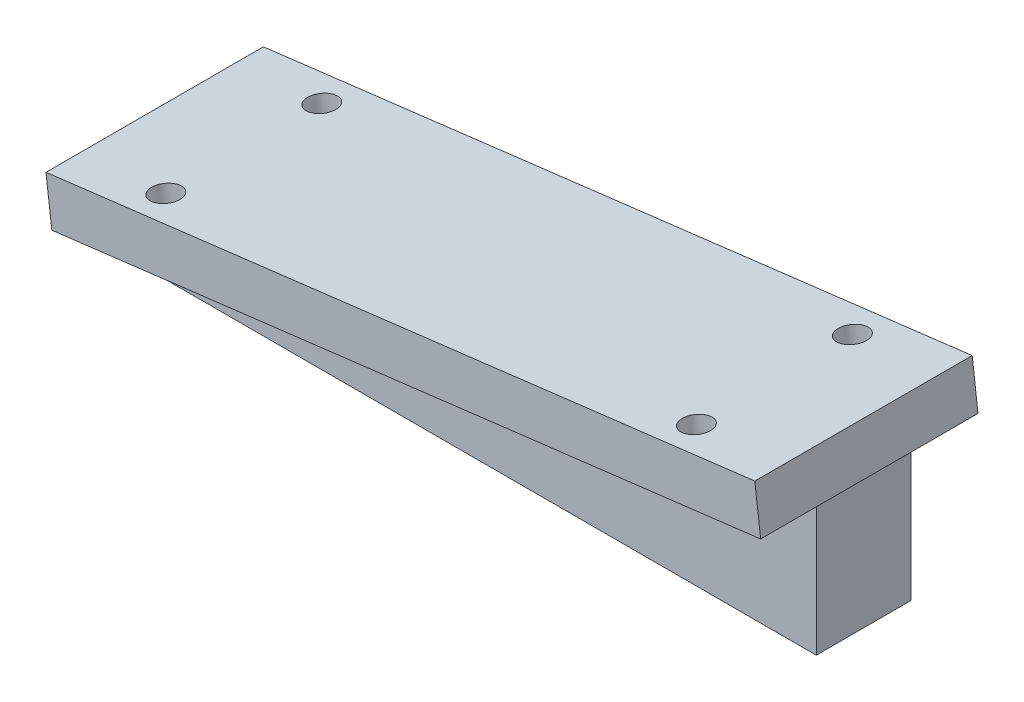
ISO-10303-21;
HEADER;
FILE_DESCRIPTION(('STEP AP214'),'2;1');
FILE_NAME('part.step','',(''),(''),'','','');
FILE_SCHEMA(('AUTOMOTIVE_DESIGN { 1 0 10303 214 1 1 1 1 }'));
ENDSEC;
DATA;
#1=APPLICATION_CONTEXT('core data for automotive mechanical design processes');
#2=APPLICATION_PROTOCOL_DEFINITION('international standard','automotive_design',2000,#1);
#3=PRODUCT_CONTEXT('',#1,'mechanical');
#4=PRODUCT('Part','Part','',(#3));
#5=PRODUCT_RELATED_PRODUCT_CATEGORY('part','',(#4));
#6=PRODUCT_DEFINITION_FORMATION('','',#4);
#7=PRODUCT_DEFINITION_CONTEXT('part definition',#1,'design');
#8=PRODUCT_DEFINITION('design','',#6,#7);
#9=PRODUCT_DEFINITION_SHAPE('','',#8);
#10=(LENGTH_UNIT() NAMED_UNIT(*) SI_UNIT(.MILLI.,.METRE.));
#11=(NAMED_UNIT(*) PLANE_ANGLE_UNIT() SI_UNIT($,.RADIAN.));
#12=(NAMED_UNIT(*) SI_UNIT($,.STERADIAN.) SOLID_ANGLE_UNIT());
#13=UNCERTAINTY_MEASURE_WITH_UNIT(LENGTH_MEASURE(1.E-05),#10,'distance_accuracy_value','');
#14=(GEOMETRIC_REPRESENTATION_CONTEXT(3) GLOBAL_UNCERTAINTY_ASSIGNED_CONTEXT((#13)) GLOBAL_UNIT_ASSIGNED_CONTEXT((#10,
#11,#12)) REPRESENTATION_CONTEXT('',''));
#15=CARTESIAN_POINT('',(0.,0.,0.));
#16=DIRECTION('',(0.,0.,1.));
#17=DIRECTION('',(1.,0.,0.));
#18=AXIS2_PLACEMENT_3D('',#15,#16,#17);
#19=CARTESIAN_POINT('',(75.0000000000001,10.,10.));
#20=DIRECTION('',(-1.,0.,0.));
#21=DIRECTION('',(0.,0.,1.));
#22=AXIS2_PLACEMENT_3D('',#19,#20,#21);
#23=PLANE('',#22);
#24=DIRECTION('',(0.,0.,-1.));
#25=VECTOR('',#24,1.);
#26=CARTESIAN_POINT('',(75.0000000000001,18.2669236514735,10.));
#27=LINE('',#26,#25);
#28=CARTESIAN_POINT('',(75.0000000000001,18.2669236514735,10.));
#29=VERTEX_POINT('',#28);
#30=CARTESIAN_POINT('',(75.0000000000001,18.2669236514735,-10.));
#31=VERTEX_POINT('',#30);
#32=EDGE_CURVE('E201',#29,#31,#27,.T.);
#33=ORIENTED_EDGE('',*,*,#32,.F.);
#34=DIRECTION('',(0.,-1.,0.));
#35=VECTOR('',#34,1.);
#36=CARTESIAN_POINT('',(75.0000000000001,10.,10.));
#37=LINE('',#36,#35);
#38=CARTESIAN_POINT('',(75.0000000000001,-10.,10.));
#39=VERTEX_POINT('',#38);
#40=EDGE_CURVE('E74',#29,#39,#37,.T.);
#41=ORIENTED_EDGE('',*,*,#40,.T.);
#42=DIRECTION('',(0.,0.,-1.));
#43=VECTOR('',#42,1.);
#44=CARTESIAN_POINT('',(75.0000000000001,-10.,10.));
#45=LINE('',#44,#43);
#46=CARTESIAN_POINT('',(75.0000000000001,-10.,-10.));
#47=VERTEX_POINT('',#46);
#48=EDGE_CURVE('E145',#39,#47,#45,.T.);
#49=ORIENTED_EDGE('',*,*,#48,.T.);
#50=DIRECTION('',(0.,-1.,0.));
#51=VECTOR('',#50,1.);
#52=CARTESIAN_POINT('',(75.0000000000001,10.,-10.));
#53=LINE('',#52,#51);
#54=EDGE_CURVE('E66',#31,#47,#53,.T.);
#55=ORIENTED_EDGE('',*,*,#54,.F.);
#56=EDGE_LOOP('',(#33,#41,#49,#55));
#57=FACE_BOUND('',#56,.T.);
#58=ADVANCED_FACE('F57',(#57),#23,.F.);
#59=CARTESIAN_POINT('',(-74.9999999999999,10.,-10.));
#60=DIRECTION('',(0.,0.,1.));
#61=DIRECTION('',(1.,0.,0.));
#62=AXIS2_PLACEMENT_3D('',#59,#60,#61);
#63=PLANE('',#62);
#64=DIRECTION('',(-0.121869343405143,0.992546151641323,0.));
#65=VECTOR('',#64,1.);
#66=CARTESIAN_POINT('',(-74.9999999999999,10.,-10.));
#67=LINE('',#66,#65);
#68=CARTESIAN_POINT('',(-73.7721543909709,0.,-10.));
#69=VERTEX_POINT('',#68);
#70=CARTESIAN_POINT('',(-74.9999999999999,10.,-9.99999999999999));
#71=VERTEX_POINT('',#70);
#72=EDGE_CURVE('E198',#69,#71,#67,.T.);
#73=ORIENTED_EDGE('',*,*,#72,.F.);
#74=DIRECTION('',(-0.992546151641323,-0.121869343405141,0.));
#75=VECTOR('',#74,1.);
#76=CARTESIAN_POINT('',(-73.7721543909709,0.,-10.));
#77=LINE('',#76,#75);
#78=EDGE_CURVE('E146',#31,#69,#77,.T.);
#79=ORIENTED_EDGE('',*,*,#78,.F.);
#80=ORIENTED_EDGE('',*,*,#54,.T.);
#81=DIRECTION('',(-1.,0.,0.));
#82=VECTOR('',#81,1.);
#83=CARTESIAN_POINT('',(-74.9999999999999,-10.,-10.));
#84=LINE('',#83,#82);
#85=CARTESIAN_POINT('',(-74.9999999999999,-10.,-10.));
#86=VERTEX_POINT('',#85);
#87=EDGE_CURVE('E212',#47,#86,#84,.T.);
#88=ORIENTED_EDGE('',*,*,#87,.T.);
#89=DIRECTION('',(0.,-1.,0.));
#90=VECTOR('',#89,1.);
#91=CARTESIAN_POINT('',(-74.9999999999999,10.,-10.));
#92=LINE('',#91,#90);
#93=EDGE_CURVE('E224',#71,#86,#92,.T.);
#94=ORIENTED_EDGE('',*,*,#93,.F.);
#95=EDGE_LOOP('',(#73,#79,#80,#88,#94));
#96=FACE_BOUND('',#95,.T.);
#97=ADVANCED_FACE('F261',(#96),#63,.F.);
#98=CARTESIAN_POINT('',(-74.9999999999999,10.,10.));
#99=DIRECTION('',(0.,0.,-1.));
#100=DIRECTION('',(-1.,0.,0.));
#101=AXIS2_PLACEMENT_3D('',#98,#99,#100);
#102=PLANE('',#101);
#103=DIRECTION('',(0.121869343405143,-0.992546151641323,0.));
#104=VECTOR('',#103,1.);
#105=CARTESIAN_POINT('',(-74.9999999999999,10.,10.));
#106=LINE('',#105,#104);
#107=CARTESIAN_POINT('',(-74.9999999999999,10.,10.));
#108=VERTEX_POINT('',#107);
#109=CARTESIAN_POINT('',(-73.7721543909709,0.,10.));
#110=VERTEX_POINT('',#109);
#111=EDGE_CURVE('E195',#108,#110,#106,.T.);
#112=ORIENTED_EDGE('',*,*,#111,.F.);
#113=DIRECTION('',(0.,-1.,0.));
#114=VECTOR('',#113,1.);
#115=CARTESIAN_POINT('',(-74.9999999999999,10.,10.));
#116=LINE('',#115,#114);
#117=CARTESIAN_POINT('',(-74.9999999999999,-10.,10.));
#118=VERTEX_POINT('',#117);
#119=EDGE_CURVE('E221',#108,#118,#116,.T.);
#120=ORIENTED_EDGE('',*,*,#119,.T.);
#121=DIRECTION('',(1.,0.,0.));
#122=VECTOR('',#121,1.);
#123=CARTESIAN_POINT('',(-74.9999999999999,-10.,10.));
#124=LINE('',#123,#122);
#125=EDGE_CURVE('E209',#118,#39,#124,.T.);
#126=ORIENTED_EDGE('',*,*,#125,.T.);
#127=ORIENTED_EDGE('',*,*,#40,.F.);
#128=DIRECTION('',(0.992546151641323,0.121869343405141,0.));
#129=VECTOR('',#128,1.);
#130=CARTESIAN_POINT('',(-73.7721543909709,0.,10.));
#131=LINE('',#130,#129);
#132=EDGE_CURVE('E12',#110,#29,#131,.T.);
#133=ORIENTED_EDGE('',*,*,#132,.F.);
#134=EDGE_LOOP('',(#112,#120,#126,#127,#133));
#135=FACE_BOUND('',#134,.T.);
#136=ADVANCED_FACE('F266',(#135),#102,.F.);
#137=CARTESIAN_POINT('',(-74.9999999999999,10.,10.));
#138=DIRECTION('',(1.,0.,0.));
#139=DIRECTION('',(0.,0.,-1.));
#140=AXIS2_PLACEMENT_3D('',#137,#138,#139);
#141=PLANE('',#140);
#142=DIRECTION('',(0.,0.,1.));
#143=VECTOR('',#142,1.);
#144=CARTESIAN_POINT('',(-74.9999999999999,-10.,10.));
#145=LINE('',#144,#143);
#146=EDGE_CURVE('E82',#86,#118,#145,.T.);
#147=ORIENTED_EDGE('',*,*,#146,.T.);
#148=ORIENTED_EDGE('',*,*,#119,.F.);
#149=DIRECTION('',(0.,0.,1.));
#150=VECTOR('',#149,1.);
#151=CARTESIAN_POINT('',(-74.9999999999999,10.,10.));
#152=LINE('',#151,#150);
#153=EDGE_CURVE('E206',#71,#108,#152,.T.);
#154=ORIENTED_EDGE('',*,*,#153,.F.);
#155=ORIENTED_EDGE('',*,*,#93,.T.);
#156=EDGE_LOOP('',(#147,#148,#154,#155));
#157=FACE_BOUND('',#156,.T.);
#158=ADVANCED_FACE('F282',(#157),#141,.F.);
#159=CARTESIAN_POINT('',(0.,-10.,0.));
#160=DIRECTION('',(0.,-1.,0.));
#161=DIRECTION('',(0.,0.,-1.));
#162=AXIS2_PLACEMENT_3D('',#159,#160,#161);
#163=PLANE('',#162);
#164=ORIENTED_EDGE('',*,*,#48,.F.);
#165=ORIENTED_EDGE('',*,*,#125,.F.);
#166=ORIENTED_EDGE('',*,*,#146,.F.);
#167=ORIENTED_EDGE('',*,*,#87,.F.);
#168=EDGE_LOOP('',(#164,#165,#166,#167));
#169=FACE_BOUND('',#168,.T.);
#170=ADVANCED_FACE('F278',(#169),#163,.T.);
#171=CARTESIAN_POINT('',(75.0000000000001,28.4176841354347,10.));
#172=DIRECTION('',(0.121869343405141,-0.992546151641323,0.));
#173=DIRECTION('',(0.992546151641323,0.121869343405141,0.));
#174=AXIS2_PLACEMENT_3D('',#171,#172,#173);
#175=PLANE('',#174);
#176=CARTESIAN_POINT('',(-56.1416231188147,12.3155175246977,16.5));
#177=DIRECTION('',(-0.121869343405141,0.992546151641323,0.));
#178=DIRECTION('',(-0.992546151641323,-0.121869343405141,0.));
#179=AXIS2_PLACEMENT_3D('',#176,#177,#178);
#180=CIRCLE('',#179,3.00000000000001);
#181=CARTESIAN_POINT('',(-59.1192615737387,11.9499094944823,16.5));
#182=VERTEX_POINT('',#181);
#183=EDGE_CURVE('E473',#182,#182,#180,.T.);
#184=ORIENTED_EDGE('',*,*,#183,.F.);
#185=EDGE_LOOP('',(#184));
#186=FACE_BOUND('',#185,.T.);
#187=CARTESIAN_POINT('',(56.141623118815,26.102166610737,16.5));
#188=DIRECTION('',(-0.121869343405141,0.992546151641323,0.));
#189=DIRECTION('',(-0.992546151641323,-0.121869343405141,0.));
#190=AXIS2_PLACEMENT_3D('',#187,#188,#189);
#191=CIRCLE('',#190,3.00000000000001);
#192=CARTESIAN_POINT('',(53.163984663891,25.7365585805216,16.5));
#193=VERTEX_POINT('',#192);
#194=EDGE_CURVE('E467',#193,#193,#191,.T.);
#195=ORIENTED_EDGE('',*,*,#194,.F.);
#196=EDGE_LOOP('',(#195));
#197=FACE_BOUND('',#196,.T.);
#198=CARTESIAN_POINT('',(56.141623118815,26.102166610737,-16.5));
#199=DIRECTION('',(-0.121869343405141,0.992546151641323,0.));
#200=DIRECTION('',(-0.992546151641323,-0.121869343405141,0.));
#201=AXIS2_PLACEMENT_3D('',#198,#199,#200);
#202=CIRCLE('',#201,3.00000000000001);
#203=CARTESIAN_POINT('',(53.163984663891,25.7365585805216,-16.5));
#204=VERTEX_POINT('',#203);
#205=EDGE_CURVE('E459',#204,#204,#202,.T.);
#206=ORIENTED_EDGE('',*,*,#205,.F.);
#207=EDGE_LOOP('',(#206));
#208=FACE_BOUND('',#207,.T.);
#209=CARTESIAN_POINT('',(-56.1416231188147,12.3155175246977,-16.5));
#210=DIRECTION('',(-0.121869343405141,0.992546151641323,0.));
#211=DIRECTION('',(-0.992546151641323,-0.121869343405141,0.));
#212=AXIS2_PLACEMENT_3D('',#209,#210,#211);
#213=CIRCLE('',#212,3.00000000000001);
#214=CARTESIAN_POINT('',(-59.1192615737387,11.9499094944823,-16.5));
#215=VERTEX_POINT('',#214);
#216=EDGE_CURVE('E169',#215,#215,#213,.T.);
#217=ORIENTED_EDGE('',*,*,#216,.F.);
#218=EDGE_LOOP('',(#217));
#219=FACE_BOUND('',#218,.T.);
#220=DIRECTION('',(0.,0.,-1.));
#221=VECTOR('',#220,1.);
#222=CARTESIAN_POINT('',(75.0000000000001,28.4176841354347,10.));
#223=LINE('',#222,#221);
#224=CARTESIAN_POINT('',(75.0000000000001,28.4176841354347,23.));
#225=VERTEX_POINT('',#224);
#226=CARTESIAN_POINT('',(75.0000000000001,28.4176841354347,-23.));
#227=VERTEX_POINT('',#226);
#228=EDGE_CURVE('E133',#225,#227,#223,.T.);
#229=ORIENTED_EDGE('',*,*,#228,.T.);
#230=DIRECTION('',(-0.992546151641323,-0.121869343405141,0.));
#231=VECTOR('',#230,1.);
#232=CARTESIAN_POINT('',(75.0000000000001,28.4176841354347,-23.));
#233=LINE('',#232,#231);
#234=CARTESIAN_POINT('',(-74.9999999999999,10.,-23.));
#235=VERTEX_POINT('',#234);
#236=EDGE_CURVE('E179',#227,#235,#233,.T.);
#237=ORIENTED_EDGE('',*,*,#236,.T.);
#238=DIRECTION('',(0.,0.,-1.));
#239=VECTOR('',#238,1.);
#240=CARTESIAN_POINT('',(-74.9999999999999,10.,23.));
#241=LINE('',#240,#239);
#242=EDGE_CURVE('E192',#71,#235,#241,.T.);
#243=ORIENTED_EDGE('',*,*,#242,.F.);
#244=ORIENTED_EDGE('',*,*,#153,.T.);
#245=CARTESIAN_POINT('',(-74.9999999999999,10.,23.));
#246=VERTEX_POINT('',#245);
#247=EDGE_CURVE('E152',#246,#108,#241,.T.);
#248=ORIENTED_EDGE('',*,*,#247,.F.);
#249=DIRECTION('',(-0.992546151641323,-0.121869343405141,0.));
#250=VECTOR('',#249,1.);
#251=CARTESIAN_POINT('',(75.0000000000001,28.4176841354347,23.));
#252=LINE('',#251,#250);
#253=EDGE_CURVE('E149',#225,#246,#252,.T.);
#254=ORIENTED_EDGE('',*,*,#253,.F.);
#255=EDGE_LOOP('',(#229,#237,#243,#244,#248,#254));
#256=FACE_BOUND('',#255,.T.);
#257=ADVANCED_FACE('F150',(#186,#197,#208,#219,#256),#175,.F.);
#258=CARTESIAN_POINT('',(76.2278456090291,18.4176841354347,23.));
#259=DIRECTION('',(-0.121869343405141,0.992546151641323,0.));
#260=DIRECTION('',(-0.992546151641323,-0.121869343405141,0.));
#261=AXIS2_PLACEMENT_3D('',#258,#259,#260);
#262=PLANE('',#261);
#263=CARTESIAN_POINT('',(-54.9137775097858,2.31551752469767,16.5));
#264=DIRECTION('',(-0.121869343405141,0.992546151641323,0.));
#265=DIRECTION('',(-0.992546151641323,-0.121869343405141,0.));
#266=AXIS2_PLACEMENT_3D('',#263,#264,#265);
#267=CIRCLE('',#266,3.00000000000001);
#268=CARTESIAN_POINT('',(-57.8914159647097,1.94990949448225,16.5));
#269=VERTEX_POINT('',#268);
#270=EDGE_CURVE('E60',#269,#269,#267,.T.);
#271=ORIENTED_EDGE('',*,*,#270,.T.);
#272=EDGE_LOOP('',(#271));
#273=FACE_BOUND('',#272,.T.);
#274=CARTESIAN_POINT('',(57.3694687278439,16.102166610737,16.5));
#275=DIRECTION('',(-0.121869343405141,0.992546151641323,0.));
#276=DIRECTION('',(-0.992546151641323,-0.121869343405141,0.));
#277=AXIS2_PLACEMENT_3D('',#274,#275,#276);
#278=CIRCLE('',#277,3.00000000000001);
#279=CARTESIAN_POINT('',(54.39183027292,15.7365585805216,16.5));
#280=VERTEX_POINT('',#279);
#281=EDGE_CURVE('E236',#280,#280,#278,.T.);
#282=ORIENTED_EDGE('',*,*,#281,.T.);
#283=EDGE_LOOP('',(#282));
#284=FACE_BOUND('',#283,.T.);
#285=CARTESIAN_POINT('',(57.3694687278439,16.102166610737,-16.5));
#286=DIRECTION('',(-0.121869343405141,0.992546151641323,0.));
#287=DIRECTION('',(-0.992546151641323,-0.121869343405141,0.));
#288=AXIS2_PLACEMENT_3D('',#285,#286,#287);
#289=CIRCLE('',#288,3.00000000000001);
#290=CARTESIAN_POINT('',(54.39183027292,15.7365585805216,-16.5));
#291=VERTEX_POINT('',#290);
#292=EDGE_CURVE('E233',#291,#291,#289,.T.);
#293=ORIENTED_EDGE('',*,*,#292,.T.);
#294=EDGE_LOOP('',(#293));
#295=FACE_BOUND('',#294,.T.);
#296=CARTESIAN_POINT('',(-54.9137775097858,2.31551752469767,-16.5));
#297=DIRECTION('',(-0.121869343405141,0.992546151641323,0.));
#298=DIRECTION('',(-0.992546151641323,-0.121869343405141,0.));
#299=AXIS2_PLACEMENT_3D('',#296,#297,#298);
#300=CIRCLE('',#299,3.00000000000001);
#301=CARTESIAN_POINT('',(-57.8914159647098,1.94990949448225,-16.5));
#302=VERTEX_POINT('',#301);
#303=EDGE_CURVE('E229',#302,#302,#300,.T.);
#304=ORIENTED_EDGE('',*,*,#303,.T.);
#305=EDGE_LOOP('',(#304));
#306=FACE_BOUND('',#305,.T.);
#307=ORIENTED_EDGE('',*,*,#32,.T.);
#308=ORIENTED_EDGE('',*,*,#78,.T.);
#309=DIRECTION('',(0.,0.,-1.));
#310=VECTOR('',#309,1.);
#311=CARTESIAN_POINT('',(-73.7721543909709,0.,23.));
#312=LINE('',#311,#310);
#313=CARTESIAN_POINT('',(-73.7721543909709,0.,-23.));
#314=VERTEX_POINT('',#313);
#315=EDGE_CURVE('E187',#69,#314,#312,.T.);
#316=ORIENTED_EDGE('',*,*,#315,.T.);
#317=DIRECTION('',(0.992546151641323,0.121869343405141,0.));
#318=VECTOR('',#317,1.);
#319=CARTESIAN_POINT('',(76.2278456090291,18.4176841354347,-23.));
#320=LINE('',#319,#318);
#321=CARTESIAN_POINT('',(76.2278456090291,18.4176841354347,-23.));
#322=VERTEX_POINT('',#321);
#323=EDGE_CURVE('E163',#314,#322,#320,.T.);
#324=ORIENTED_EDGE('',*,*,#323,.T.);
#325=DIRECTION('',(0.,0.,-1.));
#326=VECTOR('',#325,1.);
#327=CARTESIAN_POINT('',(76.2278456090291,18.4176841354347,23.));
#328=LINE('',#327,#326);
#329=CARTESIAN_POINT('',(76.2278456090291,18.4176841354347,23.));
#330=VERTEX_POINT('',#329);
#331=EDGE_CURVE('E176',#330,#322,#328,.T.);
#332=ORIENTED_EDGE('',*,*,#331,.F.);
#333=DIRECTION('',(0.992546151641323,0.121869343405141,0.));
#334=VECTOR('',#333,1.);
#335=CARTESIAN_POINT('',(76.2278456090291,18.4176841354347,23.));
#336=LINE('',#335,#334);
#337=CARTESIAN_POINT('',(-73.7721543909709,0.,23.));
#338=VERTEX_POINT('',#337);
#339=EDGE_CURVE('E160',#338,#330,#336,.T.);
#340=ORIENTED_EDGE('',*,*,#339,.F.);
#341=EDGE_CURVE('E188',#338,#110,#312,.T.);
#342=ORIENTED_EDGE('',*,*,#341,.T.);
#343=ORIENTED_EDGE('',*,*,#132,.T.);
#344=EDGE_LOOP('',(#307,#308,#316,#324,#332,#340,#342,#343));
#345=FACE_BOUND('',#344,.T.);
#346=ADVANCED_FACE('F245',(#273,#284,#295,#306,#345),#262,.F.);
#347=CARTESIAN_POINT('',(-74.9999999999999,10.,23.));
#348=DIRECTION('',(0.992546151641323,0.121869343405143,0.));
#349=DIRECTION('',(-0.121869343405143,0.992546151641323,0.));
#350=AXIS2_PLACEMENT_3D('',#347,#348,#349);
#351=PLANE('',#350);
#352=ORIENTED_EDGE('',*,*,#315,.F.);
#353=ORIENTED_EDGE('',*,*,#72,.T.);
#354=ORIENTED_EDGE('',*,*,#242,.T.);
#355=DIRECTION('',(0.121869343405143,-0.992546151641323,0.));
#356=VECTOR('',#355,1.);
#357=CARTESIAN_POINT('',(-74.9999999999999,10.,-23.));
#358=LINE('',#357,#356);
#359=EDGE_CURVE('E166',#235,#314,#358,.T.);
#360=ORIENTED_EDGE('',*,*,#359,.T.);
#361=EDGE_LOOP('',(#352,#353,#354,#360));
#362=FACE_BOUND('',#361,.T.);
#363=ADVANCED_FACE('F290',(#362),#351,.F.);
#364=ORIENTED_EDGE('',*,*,#247,.T.);
#365=ORIENTED_EDGE('',*,*,#111,.T.);
#366=ORIENTED_EDGE('',*,*,#341,.F.);
#367=DIRECTION('',(0.121869343405143,-0.992546151641323,0.));
#368=VECTOR('',#367,1.);
#369=CARTESIAN_POINT('',(-74.9999999999999,10.,23.));
#370=LINE('',#369,#368);
#371=EDGE_CURVE('E156',#246,#338,#370,.T.);
#372=ORIENTED_EDGE('',*,*,#371,.F.);
#373=EDGE_LOOP('',(#364,#365,#366,#372));
#374=FACE_BOUND('',#373,.T.);
#375=ADVANCED_FACE('F307',(#374),#351,.F.);
#376=CARTESIAN_POINT('',(75.0000000000001,28.4176841354347,23.));
#377=DIRECTION('',(-0.992546151641323,-0.121869343405141,0.));
#378=DIRECTION('',(0.121869343405141,-0.992546151641323,0.));
#379=AXIS2_PLACEMENT_3D('',#376,#377,#378);
#380=PLANE('',#379);
#381=DIRECTION('',(-0.121869343405141,0.992546151641323,0.));
#382=VECTOR('',#381,1.);
#383=CARTESIAN_POINT('',(75.0000000000001,28.4176841354347,-23.));
#384=LINE('',#383,#382);
#385=EDGE_CURVE('E140',#322,#227,#384,.T.);
#386=ORIENTED_EDGE('',*,*,#385,.T.);
#387=ORIENTED_EDGE('',*,*,#228,.F.);
#388=DIRECTION('',(-0.121869343405141,0.992546151641323,0.));
#389=VECTOR('',#388,1.);
#390=CARTESIAN_POINT('',(75.0000000000001,28.4176841354347,23.));
#391=LINE('',#390,#389);
#392=EDGE_CURVE('E138',#330,#225,#391,.T.);
#393=ORIENTED_EDGE('',*,*,#392,.F.);
#394=ORIENTED_EDGE('',*,*,#331,.T.);
#395=EDGE_LOOP('',(#386,#387,#393,#394));
#396=FACE_BOUND('',#395,.T.);
#397=ADVANCED_FACE('F135',(#396),#380,.F.);
#398=CARTESIAN_POINT('',(0.,0.,23.));
#399=DIRECTION('',(0.,0.,-1.));
#400=DIRECTION('',(-1.,0.,0.));
#401=AXIS2_PLACEMENT_3D('',#398,#399,#400);
#402=PLANE('',#401);
#403=ORIENTED_EDGE('',*,*,#392,.T.);
#404=ORIENTED_EDGE('',*,*,#253,.T.);
#405=ORIENTED_EDGE('',*,*,#371,.T.);
#406=ORIENTED_EDGE('',*,*,#339,.T.);
#407=EDGE_LOOP('',(#403,#404,#405,#406));
#408=FACE_BOUND('',#407,.T.);
#409=ADVANCED_FACE('F158',(#408),#402,.F.);
#410=CARTESIAN_POINT('',(0.,0.,-23.));
#411=DIRECTION('',(0.,0.,-1.));
#412=DIRECTION('',(-1.,0.,0.));
#413=AXIS2_PLACEMENT_3D('',#410,#411,#412);
#414=PLANE('',#413);
#415=ORIENTED_EDGE('',*,*,#385,.F.);
#416=ORIENTED_EDGE('',*,*,#323,.F.);
#417=ORIENTED_EDGE('',*,*,#359,.F.);
#418=ORIENTED_EDGE('',*,*,#236,.F.);
#419=EDGE_LOOP('',(#415,#416,#417,#418));
#420=FACE_BOUND('',#419,.T.);
#421=ADVANCED_FACE('F292',(#420),#414,.T.);
#422=CARTESIAN_POINT('',(-50.5356333221783,-33.3416054508032,-16.5));
#423=DIRECTION('',(-0.121869343405141,0.992546151641323,0.));
#424=DIRECTION('',(-0.992546151641323,-0.121869343405141,0.));
#425=AXIS2_PLACEMENT_3D('',#422,#423,#424);
#426=CYLINDRICAL_SURFACE('',#425,3.00000000000001);
#427=ORIENTED_EDGE('',*,*,#216,.T.);
#428=EDGE_LOOP('',(#427));
#429=FACE_BOUND('',#428,.T.);
#430=ORIENTED_EDGE('',*,*,#303,.F.);
#431=EDGE_LOOP('',(#430));
#432=FACE_BOUND('',#431,.T.);
#433=ADVANCED_FACE('F294',(#429,#432),#426,.F.);
#434=CARTESIAN_POINT('',(61.7476129154514,-19.5549563647638,-16.5));
#435=DIRECTION('',(-0.121869343405141,0.992546151641323,0.));
#436=DIRECTION('',(-0.992546151641323,-0.121869343405141,0.));
#437=AXIS2_PLACEMENT_3D('',#434,#435,#436);
#438=CYLINDRICAL_SURFACE('',#437,3.00000000000001);
#439=ORIENTED_EDGE('',*,*,#205,.T.);
#440=EDGE_LOOP('',(#439));
#441=FACE_BOUND('',#440,.T.);
#442=ORIENTED_EDGE('',*,*,#292,.F.);
#443=EDGE_LOOP('',(#442));
#444=FACE_BOUND('',#443,.T.);
#445=ADVANCED_FACE('F255',(#441,#444),#438,.F.);
#446=CARTESIAN_POINT('',(61.7476129154514,-19.5549563647638,16.5));
#447=DIRECTION('',(-0.121869343405141,0.992546151641323,0.));
#448=DIRECTION('',(-0.992546151641323,-0.121869343405141,0.));
#449=AXIS2_PLACEMENT_3D('',#446,#447,#448);
#450=CYLINDRICAL_SURFACE('',#449,3.00000000000001);
#451=ORIENTED_EDGE('',*,*,#194,.T.);
#452=EDGE_LOOP('',(#451));
#453=FACE_BOUND('',#452,.T.);
#454=ORIENTED_EDGE('',*,*,#281,.F.);
#455=EDGE_LOOP('',(#454));
#456=FACE_BOUND('',#455,.T.);
#457=ADVANCED_FACE('F249',(#453,#456),#450,.F.);
#458=CARTESIAN_POINT('',(-50.5356333221783,-33.3416054508032,16.5));
#459=DIRECTION('',(-0.121869343405141,0.992546151641323,0.));
#460=DIRECTION('',(-0.992546151641323,-0.121869343405141,0.));
#461=AXIS2_PLACEMENT_3D('',#458,#459,#460);
#462=CYLINDRICAL_SURFACE('',#461,3.00000000000001);
#463=ORIENTED_EDGE('',*,*,#183,.T.);
#464=EDGE_LOOP('',(#463));
#465=FACE_BOUND('',#464,.T.);
#466=ORIENTED_EDGE('',*,*,#270,.F.);
#467=EDGE_LOOP('',(#466));
#468=FACE_BOUND('',#467,.T.);
#469=ADVANCED_FACE('F247',(#465,#468),#462,.F.);
#470=CLOSED_SHELL('',(#58,#97,#136,#158,#170,#257,#346,#363,#375,#397,#409,#421,#433,#445,#457,#469));
#471=MANIFOLD_SOLID_BREP('B2',#470);
#472=ADVANCED_BREP_SHAPE_REPRESENTATION('',(#18,#471),#14);
#473=SHAPE_DEFINITION_REPRESENTATION(#9,#472);
ENDSEC;
END-ISO-10303-21;
